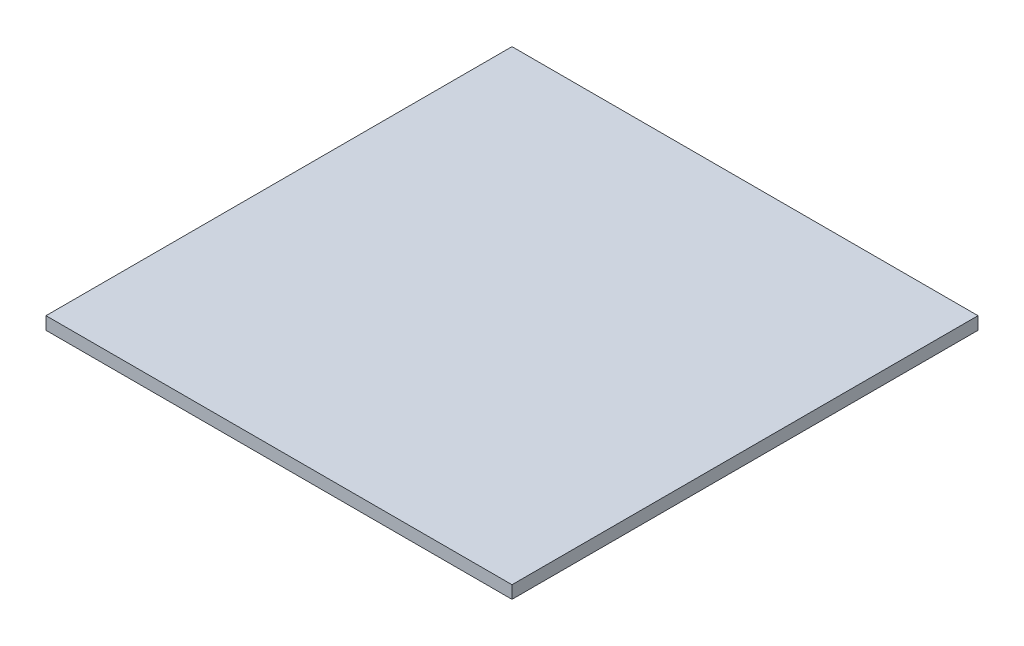
ISO-10303-21;
HEADER;
FILE_DESCRIPTION(('STEP AP214'),'2;1');
FILE_NAME('part.step','',(''),(''),'','','');
FILE_SCHEMA(('AUTOMOTIVE_DESIGN { 1 0 10303 214 1 1 1 1 }'));
ENDSEC;
DATA;
#1=APPLICATION_CONTEXT('core data for automotive mechanical design processes');
#2=APPLICATION_PROTOCOL_DEFINITION('international standard','automotive_design',2000,#1);
#3=PRODUCT_CONTEXT('',#1,'mechanical');
#4=PRODUCT('Part','Part','',(#3));
#5=PRODUCT_RELATED_PRODUCT_CATEGORY('part','',(#4));
#6=PRODUCT_DEFINITION_FORMATION('','',#4);
#7=PRODUCT_DEFINITION_CONTEXT('part definition',#1,'design');
#8=PRODUCT_DEFINITION('design','',#6,#7);
#9=PRODUCT_DEFINITION_SHAPE('','',#8);
#10=(LENGTH_UNIT() NAMED_UNIT(*) SI_UNIT(.MILLI.,.METRE.));
#11=(NAMED_UNIT(*) PLANE_ANGLE_UNIT() SI_UNIT($,.RADIAN.));
#12=(NAMED_UNIT(*) SI_UNIT($,.STERADIAN.) SOLID_ANGLE_UNIT());
#13=UNCERTAINTY_MEASURE_WITH_UNIT(LENGTH_MEASURE(1.E-05),#10,'distance_accuracy_value','');
#14=(GEOMETRIC_REPRESENTATION_CONTEXT(3) GLOBAL_UNCERTAINTY_ASSIGNED_CONTEXT((#13)) GLOBAL_UNIT_ASSIGNED_CONTEXT((#10,
#11,#12)) REPRESENTATION_CONTEXT('',''));
#15=CARTESIAN_POINT('',(0.,0.,0.));
#16=DIRECTION('',(0.,0.,1.));
#17=DIRECTION('',(1.,0.,0.));
#18=AXIS2_PLACEMENT_3D('',#15,#16,#17);
#19=CARTESIAN_POINT('',(275.,15.,-275.));
#20=DIRECTION('',(-1.,0.,0.));
#21=DIRECTION('',(0.,0.,1.));
#22=AXIS2_PLACEMENT_3D('',#19,#20,#21);
#23=PLANE('',#22);
#24=DIRECTION('',(0.,0.,-1.));
#25=VECTOR('',#24,1.);
#26=CARTESIAN_POINT('',(275.,0.,-275.));
#27=LINE('',#26,#25);
#28=CARTESIAN_POINT('',(275.,0.,275.));
#29=VERTEX_POINT('',#28);
#30=CARTESIAN_POINT('',(275.,0.,-275.));
#31=VERTEX_POINT('',#30);
#32=EDGE_CURVE('E101',#29,#31,#27,.T.);
#33=ORIENTED_EDGE('',*,*,#32,.T.);
#34=DIRECTION('',(0.,-1.,0.));
#35=VECTOR('',#34,1.);
#36=CARTESIAN_POINT('',(275.,15.,-275.));
#37=LINE('',#36,#35);
#38=CARTESIAN_POINT('',(275.,15.,-275.));
#39=VERTEX_POINT('',#38);
#40=EDGE_CURVE('E11',#39,#31,#37,.T.);
#41=ORIENTED_EDGE('',*,*,#40,.F.);
#42=DIRECTION('',(0.,0.,-1.));
#43=VECTOR('',#42,1.);
#44=CARTESIAN_POINT('',(275.,15.,-275.));
#45=LINE('',#44,#43);
#46=CARTESIAN_POINT('',(275.,15.,275.));
#47=VERTEX_POINT('',#46);
#48=EDGE_CURVE('E89',#47,#39,#45,.T.);
#49=ORIENTED_EDGE('',*,*,#48,.F.);
#50=DIRECTION('',(0.,-1.,0.));
#51=VECTOR('',#50,1.);
#52=CARTESIAN_POINT('',(275.,15.,275.));
#53=LINE('',#52,#51);
#54=EDGE_CURVE('E97',#47,#29,#53,.T.);
#55=ORIENTED_EDGE('',*,*,#54,.T.);
#56=EDGE_LOOP('',(#33,#41,#49,#55));
#57=FACE_BOUND('',#56,.T.);
#58=ADVANCED_FACE('F38',(#57),#23,.F.);
#59=CARTESIAN_POINT('',(-275.,15.,-275.));
#60=DIRECTION('',(0.,0.,1.));
#61=DIRECTION('',(1.,0.,0.));
#62=AXIS2_PLACEMENT_3D('',#59,#60,#61);
#63=PLANE('',#62);
#64=DIRECTION('',(-1.,0.,0.));
#65=VECTOR('',#64,1.);
#66=CARTESIAN_POINT('',(-275.,0.,-275.));
#67=LINE('',#66,#65);
#68=CARTESIAN_POINT('',(-275.,0.,-275.));
#69=VERTEX_POINT('',#68);
#70=EDGE_CURVE('E93',#31,#69,#67,.T.);
#71=ORIENTED_EDGE('',*,*,#70,.T.);
#72=DIRECTION('',(0.,-1.,0.));
#73=VECTOR('',#72,1.);
#74=CARTESIAN_POINT('',(-275.,15.,-275.));
#75=LINE('',#74,#73);
#76=CARTESIAN_POINT('',(-275.,15.,-275.));
#77=VERTEX_POINT('',#76);
#78=EDGE_CURVE('E46',#77,#69,#75,.T.);
#79=ORIENTED_EDGE('',*,*,#78,.F.);
#80=DIRECTION('',(-1.,0.,0.));
#81=VECTOR('',#80,1.);
#82=CARTESIAN_POINT('',(-275.,15.,-275.));
#83=LINE('',#82,#81);
#84=EDGE_CURVE('E84',#39,#77,#83,.T.);
#85=ORIENTED_EDGE('',*,*,#84,.F.);
#86=ORIENTED_EDGE('',*,*,#40,.T.);
#87=EDGE_LOOP('',(#71,#79,#85,#86));
#88=FACE_BOUND('',#87,.T.);
#89=ADVANCED_FACE('F92',(#88),#63,.F.);
#90=CARTESIAN_POINT('',(-275.,15.,-275.));
#91=DIRECTION('',(1.,0.,0.));
#92=DIRECTION('',(0.,0.,-1.));
#93=AXIS2_PLACEMENT_3D('',#90,#91,#92);
#94=PLANE('',#93);
#95=DIRECTION('',(0.,0.,1.));
#96=VECTOR('',#95,1.);
#97=CARTESIAN_POINT('',(-275.,0.,-275.));
#98=LINE('',#97,#96);
#99=CARTESIAN_POINT('',(-275.,0.,275.));
#100=VERTEX_POINT('',#99);
#101=EDGE_CURVE('E71',#69,#100,#98,.T.);
#102=ORIENTED_EDGE('',*,*,#101,.T.);
#103=DIRECTION('',(0.,-1.,0.));
#104=VECTOR('',#103,1.);
#105=CARTESIAN_POINT('',(-275.,15.,275.));
#106=LINE('',#105,#104);
#107=CARTESIAN_POINT('',(-275.,15.,275.));
#108=VERTEX_POINT('',#107);
#109=EDGE_CURVE('E94',#108,#100,#106,.T.);
#110=ORIENTED_EDGE('',*,*,#109,.F.);
#111=DIRECTION('',(0.,0.,1.));
#112=VECTOR('',#111,1.);
#113=CARTESIAN_POINT('',(-275.,15.,-275.));
#114=LINE('',#113,#112);
#115=EDGE_CURVE('E87',#77,#108,#114,.T.);
#116=ORIENTED_EDGE('',*,*,#115,.F.);
#117=ORIENTED_EDGE('',*,*,#78,.T.);
#118=EDGE_LOOP('',(#102,#110,#116,#117));
#119=FACE_BOUND('',#118,.T.);
#120=ADVANCED_FACE('F95',(#119),#94,.F.);
#121=CARTESIAN_POINT('',(-275.,15.,275.));
#122=DIRECTION('',(0.,0.,-1.));
#123=DIRECTION('',(-1.,0.,0.));
#124=AXIS2_PLACEMENT_3D('',#121,#122,#123);
#125=PLANE('',#124);
#126=DIRECTION('',(1.,0.,0.));
#127=VECTOR('',#126,1.);
#128=CARTESIAN_POINT('',(-275.,0.,275.));
#129=LINE('',#128,#127);
#130=EDGE_CURVE('E77',#100,#29,#129,.T.);
#131=ORIENTED_EDGE('',*,*,#130,.T.);
#132=ORIENTED_EDGE('',*,*,#54,.F.);
#133=DIRECTION('',(1.,0.,0.));
#134=VECTOR('',#133,1.);
#135=CARTESIAN_POINT('',(-275.,15.,275.));
#136=LINE('',#135,#134);
#137=EDGE_CURVE('E54',#108,#47,#136,.T.);
#138=ORIENTED_EDGE('',*,*,#137,.F.);
#139=ORIENTED_EDGE('',*,*,#109,.T.);
#140=EDGE_LOOP('',(#131,#132,#138,#139));
#141=FACE_BOUND('',#140,.T.);
#142=ADVANCED_FACE('F108',(#141),#125,.F.);
#143=CARTESIAN_POINT('',(0.,15.,0.));
#144=DIRECTION('',(0.,1.,0.));
#145=DIRECTION('',(0.,0.,1.));
#146=AXIS2_PLACEMENT_3D('',#143,#144,#145);
#147=PLANE('',#146);
#148=ORIENTED_EDGE('',*,*,#48,.T.);
#149=ORIENTED_EDGE('',*,*,#84,.T.);
#150=ORIENTED_EDGE('',*,*,#115,.T.);
#151=ORIENTED_EDGE('',*,*,#137,.T.);
#152=EDGE_LOOP('',(#148,#149,#150,#151));
#153=FACE_BOUND('',#152,.T.);
#154=ADVANCED_FACE('F85',(#153),#147,.T.);
#155=CARTESIAN_POINT('',(0.,0.,0.));
#156=DIRECTION('',(0.,1.,0.));
#157=DIRECTION('',(0.,0.,1.));
#158=AXIS2_PLACEMENT_3D('',#155,#156,#157);
#159=PLANE('',#158);
#160=ORIENTED_EDGE('',*,*,#32,.F.);
#161=ORIENTED_EDGE('',*,*,#130,.F.);
#162=ORIENTED_EDGE('',*,*,#101,.F.);
#163=ORIENTED_EDGE('',*,*,#70,.F.);
#164=EDGE_LOOP('',(#160,#161,#162,#163));
#165=FACE_BOUND('',#164,.T.);
#166=ADVANCED_FACE('F111',(#165),#159,.F.);
#167=CLOSED_SHELL('',(#58,#89,#120,#142,#154,#166));
#168=MANIFOLD_SOLID_BREP('B2',#167);
#169=ADVANCED_BREP_SHAPE_REPRESENTATION('',(#18,#168),#14);
#170=SHAPE_DEFINITION_REPRESENTATION(#9,#169);
ENDSEC;
END-ISO-10303-21;
